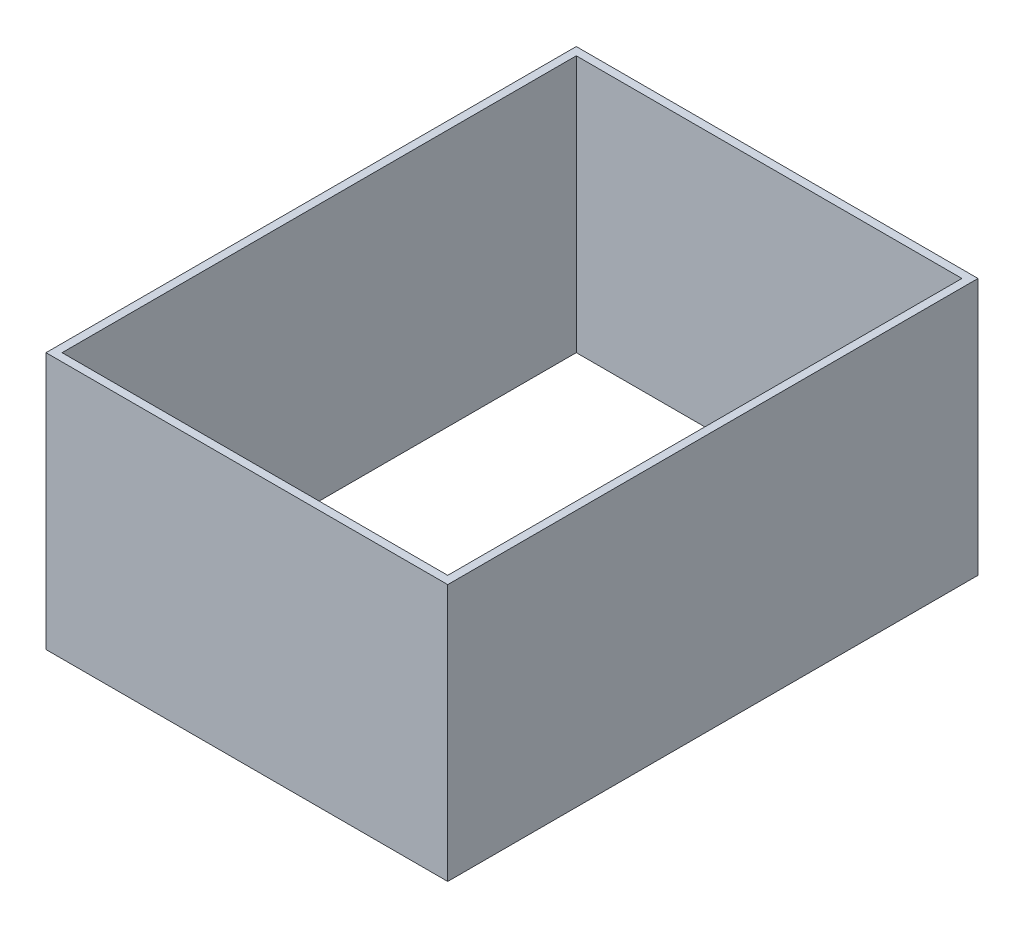
ISO-10303-21;
HEADER;
FILE_DESCRIPTION(('STEP AP214'),'2;1');
FILE_NAME('part.step','',(''),(''),'','','');
FILE_SCHEMA(('AUTOMOTIVE_DESIGN { 1 0 10303 214 1 1 1 1 }'));
ENDSEC;
DATA;
#1=APPLICATION_CONTEXT('core data for automotive mechanical design processes');
#2=APPLICATION_PROTOCOL_DEFINITION('international standard','automotive_design',2000,#1);
#3=PRODUCT_CONTEXT('',#1,'mechanical');
#4=PRODUCT('Part','Part','',(#3));
#5=PRODUCT_RELATED_PRODUCT_CATEGORY('part','',(#4));
#6=PRODUCT_DEFINITION_FORMATION('','',#4);
#7=PRODUCT_DEFINITION_CONTEXT('part definition',#1,'design');
#8=PRODUCT_DEFINITION('design','',#6,#7);
#9=PRODUCT_DEFINITION_SHAPE('','',#8);
#10=(LENGTH_UNIT() NAMED_UNIT(*) SI_UNIT(.MILLI.,.METRE.));
#11=(NAMED_UNIT(*) PLANE_ANGLE_UNIT() SI_UNIT($,.RADIAN.));
#12=(NAMED_UNIT(*) SI_UNIT($,.STERADIAN.) SOLID_ANGLE_UNIT());
#13=UNCERTAINTY_MEASURE_WITH_UNIT(LENGTH_MEASURE(1.E-05),#10,'distance_accuracy_value','');
#14=(GEOMETRIC_REPRESENTATION_CONTEXT(3) GLOBAL_UNCERTAINTY_ASSIGNED_CONTEXT((#13)) GLOBAL_UNIT_ASSIGNED_CONTEXT((#10,
#11,#12)) REPRESENTATION_CONTEXT('',''));
#15=CARTESIAN_POINT('',(0.,0.,0.));
#16=DIRECTION('',(0.,0.,1.));
#17=DIRECTION('',(1.,0.,0.));
#18=AXIS2_PLACEMENT_3D('',#15,#16,#17);
#19=CARTESIAN_POINT('',(0.,101.6,0.));
#20=DIRECTION('',(0.,-1.,0.));
#21=DIRECTION('',(0.,0.,-1.));
#22=AXIS2_PLACEMENT_3D('',#19,#20,#21);
#23=PLANE('',#22);
#24=DIRECTION('',(0.,0.,-1.));
#25=VECTOR('',#24,1.);
#26=CARTESIAN_POINT('',(79.375,101.6,0.));
#27=LINE('',#26,#25);
#28=CARTESIAN_POINT('',(79.375,101.6,104.775));
#29=VERTEX_POINT('',#28);
#30=CARTESIAN_POINT('',(79.375,101.6,-104.775));
#31=VERTEX_POINT('',#30);
#32=EDGE_CURVE('E181',#29,#31,#27,.T.);
#33=ORIENTED_EDGE('',*,*,#32,.T.);
#34=DIRECTION('',(-1.,0.,0.));
#35=VECTOR('',#34,1.);
#36=CARTESIAN_POINT('',(0.,101.6,-104.775));
#37=LINE('',#36,#35);
#38=CARTESIAN_POINT('',(-79.375,101.6,-104.775));
#39=VERTEX_POINT('',#38);
#40=EDGE_CURVE('E190',#31,#39,#37,.T.);
#41=ORIENTED_EDGE('',*,*,#40,.T.);
#42=DIRECTION('',(0.,0.,1.));
#43=VECTOR('',#42,1.);
#44=CARTESIAN_POINT('',(-79.375,101.6,0.));
#45=LINE('',#44,#43);
#46=CARTESIAN_POINT('',(-79.375,101.6,104.775));
#47=VERTEX_POINT('',#46);
#48=EDGE_CURVE('E192',#39,#47,#45,.T.);
#49=ORIENTED_EDGE('',*,*,#48,.T.);
#50=DIRECTION('',(1.,0.,0.));
#51=VECTOR('',#50,1.);
#52=CARTESIAN_POINT('',(0.,101.6,104.775));
#53=LINE('',#52,#51);
#54=EDGE_CURVE('E49',#47,#29,#53,.T.);
#55=ORIENTED_EDGE('',*,*,#54,.T.);
#56=EDGE_LOOP('',(#33,#41,#49,#55));
#57=FACE_BOUND('',#56,.T.);
#58=DIRECTION('',(0.,0.,-1.));
#59=VECTOR('',#58,1.);
#60=CARTESIAN_POINT('',(76.2,101.6,101.6));
#61=LINE('',#60,#59);
#62=CARTESIAN_POINT('',(76.2,101.6,101.6));
#63=VERTEX_POINT('',#62);
#64=CARTESIAN_POINT('',(76.2,101.6,-101.6));
#65=VERTEX_POINT('',#64);
#66=EDGE_CURVE('E115',#63,#65,#61,.T.);
#67=ORIENTED_EDGE('',*,*,#66,.F.);
#68=DIRECTION('',(1.,0.,0.));
#69=VECTOR('',#68,1.);
#70=CARTESIAN_POINT('',(-76.2,101.6,101.6));
#71=LINE('',#70,#69);
#72=CARTESIAN_POINT('',(-76.2,101.6,101.6));
#73=VERTEX_POINT('',#72);
#74=EDGE_CURVE('E142',#73,#63,#71,.T.);
#75=ORIENTED_EDGE('',*,*,#74,.F.);
#76=DIRECTION('',(0.,0.,1.));
#77=VECTOR('',#76,1.);
#78=CARTESIAN_POINT('',(-76.2,101.6,101.6));
#79=LINE('',#78,#77);
#80=CARTESIAN_POINT('',(-76.2,101.6,-101.6));
#81=VERTEX_POINT('',#80);
#82=EDGE_CURVE('E138',#81,#73,#79,.T.);
#83=ORIENTED_EDGE('',*,*,#82,.F.);
#84=DIRECTION('',(-1.,0.,0.));
#85=VECTOR('',#84,1.);
#86=CARTESIAN_POINT('',(-76.2,101.6,-101.6));
#87=LINE('',#86,#85);
#88=EDGE_CURVE('E126',#65,#81,#87,.T.);
#89=ORIENTED_EDGE('',*,*,#88,.F.);
#90=EDGE_LOOP('',(#67,#75,#83,#89));
#91=FACE_BOUND('',#90,.T.);
#92=ADVANCED_FACE('F45',(#57,#91),#23,.F.);
#93=CARTESIAN_POINT('',(0.,0.,0.));
#94=DIRECTION('',(0.,-1.,0.));
#95=DIRECTION('',(0.,0.,-1.));
#96=AXIS2_PLACEMENT_3D('',#93,#94,#95);
#97=PLANE('',#96);
#98=DIRECTION('',(0.,0.,-1.));
#99=VECTOR('',#98,1.);
#100=CARTESIAN_POINT('',(79.375,0.,0.));
#101=LINE('',#100,#99);
#102=CARTESIAN_POINT('',(79.375,0.,104.775));
#103=VERTEX_POINT('',#102);
#104=CARTESIAN_POINT('',(79.375,0.,-104.775));
#105=VERTEX_POINT('',#104);
#106=EDGE_CURVE('E134',#103,#105,#101,.T.);
#107=ORIENTED_EDGE('',*,*,#106,.F.);
#108=DIRECTION('',(1.,0.,0.));
#109=VECTOR('',#108,1.);
#110=CARTESIAN_POINT('',(0.,0.,104.775));
#111=LINE('',#110,#109);
#112=CARTESIAN_POINT('',(-79.375,0.,104.775));
#113=VERTEX_POINT('',#112);
#114=EDGE_CURVE('E178',#113,#103,#111,.T.);
#115=ORIENTED_EDGE('',*,*,#114,.F.);
#116=DIRECTION('',(0.,0.,1.));
#117=VECTOR('',#116,1.);
#118=CARTESIAN_POINT('',(-79.375,0.,0.));
#119=LINE('',#118,#117);
#120=CARTESIAN_POINT('',(-79.375,0.,-104.775));
#121=VERTEX_POINT('',#120);
#122=EDGE_CURVE('E182',#121,#113,#119,.T.);
#123=ORIENTED_EDGE('',*,*,#122,.F.);
#124=DIRECTION('',(-1.,0.,0.));
#125=VECTOR('',#124,1.);
#126=CARTESIAN_POINT('',(0.,0.,-104.775));
#127=LINE('',#126,#125);
#128=EDGE_CURVE('E177',#105,#121,#127,.T.);
#129=ORIENTED_EDGE('',*,*,#128,.F.);
#130=EDGE_LOOP('',(#107,#115,#123,#129));
#131=FACE_BOUND('',#130,.T.);
#132=DIRECTION('',(1.,0.,0.));
#133=VECTOR('',#132,1.);
#134=CARTESIAN_POINT('',(-76.2,0.,101.6));
#135=LINE('',#134,#133);
#136=CARTESIAN_POINT('',(-76.2,0.,101.6));
#137=VERTEX_POINT('',#136);
#138=CARTESIAN_POINT('',(76.2,0.,101.6));
#139=VERTEX_POINT('',#138);
#140=EDGE_CURVE('E127',#137,#139,#135,.T.);
#141=ORIENTED_EDGE('',*,*,#140,.T.);
#142=DIRECTION('',(0.,0.,-1.));
#143=VECTOR('',#142,1.);
#144=CARTESIAN_POINT('',(76.2,0.,101.6));
#145=LINE('',#144,#143);
#146=CARTESIAN_POINT('',(76.2,0.,-101.6));
#147=VERTEX_POINT('',#146);
#148=EDGE_CURVE('E147',#139,#147,#145,.T.);
#149=ORIENTED_EDGE('',*,*,#148,.T.);
#150=DIRECTION('',(-1.,0.,0.));
#151=VECTOR('',#150,1.);
#152=CARTESIAN_POINT('',(-76.2,0.,-101.6));
#153=LINE('',#152,#151);
#154=CARTESIAN_POINT('',(-76.2,0.,-101.6));
#155=VERTEX_POINT('',#154);
#156=EDGE_CURVE('E132',#147,#155,#153,.T.);
#157=ORIENTED_EDGE('',*,*,#156,.T.);
#158=DIRECTION('',(0.,0.,1.));
#159=VECTOR('',#158,1.);
#160=CARTESIAN_POINT('',(-76.2,0.,101.6));
#161=LINE('',#160,#159);
#162=EDGE_CURVE('E70',#155,#137,#161,.T.);
#163=ORIENTED_EDGE('',*,*,#162,.T.);
#164=EDGE_LOOP('',(#141,#149,#157,#163));
#165=FACE_BOUND('',#164,.T.);
#166=ADVANCED_FACE('F214',(#131,#165),#97,.T.);
#167=CARTESIAN_POINT('',(79.375,101.6,101.6));
#168=DIRECTION('',(-1.,0.,0.));
#169=DIRECTION('',(0.,0.,1.));
#170=AXIS2_PLACEMENT_3D('',#167,#168,#169);
#171=PLANE('',#170);
#172=ORIENTED_EDGE('',*,*,#106,.T.);
#173=DIRECTION('',(0.,-1.,0.));
#174=VECTOR('',#173,1.);
#175=CARTESIAN_POINT('',(79.375,101.6,-104.775));
#176=LINE('',#175,#174);
#177=EDGE_CURVE('E11',#31,#105,#176,.T.);
#178=ORIENTED_EDGE('',*,*,#177,.F.);
#179=ORIENTED_EDGE('',*,*,#32,.F.);
#180=DIRECTION('',(0.,-1.,0.));
#181=VECTOR('',#180,1.);
#182=CARTESIAN_POINT('',(79.375,101.6,104.775));
#183=LINE('',#182,#181);
#184=EDGE_CURVE('E163',#29,#103,#183,.T.);
#185=ORIENTED_EDGE('',*,*,#184,.T.);
#186=EDGE_LOOP('',(#172,#178,#179,#185));
#187=FACE_BOUND('',#186,.T.);
#188=ADVANCED_FACE('F206',(#187),#171,.F.);
#189=CARTESIAN_POINT('',(-76.2,101.6,-104.775));
#190=DIRECTION('',(0.,0.,1.));
#191=DIRECTION('',(1.,0.,0.));
#192=AXIS2_PLACEMENT_3D('',#189,#190,#191);
#193=PLANE('',#192);
#194=ORIENTED_EDGE('',*,*,#128,.T.);
#195=DIRECTION('',(0.,-1.,0.));
#196=VECTOR('',#195,1.);
#197=CARTESIAN_POINT('',(-79.375,101.6,-104.775));
#198=LINE('',#197,#196);
#199=EDGE_CURVE('E55',#39,#121,#198,.T.);
#200=ORIENTED_EDGE('',*,*,#199,.F.);
#201=ORIENTED_EDGE('',*,*,#40,.F.);
#202=ORIENTED_EDGE('',*,*,#177,.T.);
#203=EDGE_LOOP('',(#194,#200,#201,#202));
#204=FACE_BOUND('',#203,.T.);
#205=ADVANCED_FACE('F208',(#204),#193,.F.);
#206=CARTESIAN_POINT('',(-79.375,101.6,101.6));
#207=DIRECTION('',(1.,0.,0.));
#208=DIRECTION('',(0.,0.,-1.));
#209=AXIS2_PLACEMENT_3D('',#206,#207,#208);
#210=PLANE('',#209);
#211=ORIENTED_EDGE('',*,*,#122,.T.);
#212=DIRECTION('',(0.,-1.,0.));
#213=VECTOR('',#212,1.);
#214=CARTESIAN_POINT('',(-79.375,101.6,104.775));
#215=LINE('',#214,#213);
#216=EDGE_CURVE('E167',#47,#113,#215,.T.);
#217=ORIENTED_EDGE('',*,*,#216,.F.);
#218=ORIENTED_EDGE('',*,*,#48,.F.);
#219=ORIENTED_EDGE('',*,*,#199,.T.);
#220=EDGE_LOOP('',(#211,#217,#218,#219));
#221=FACE_BOUND('',#220,.T.);
#222=ADVANCED_FACE('F212',(#221),#210,.F.);
#223=CARTESIAN_POINT('',(-76.2,101.6,104.775));
#224=DIRECTION('',(0.,0.,-1.));
#225=DIRECTION('',(-1.,0.,0.));
#226=AXIS2_PLACEMENT_3D('',#223,#224,#225);
#227=PLANE('',#226);
#228=ORIENTED_EDGE('',*,*,#114,.T.);
#229=ORIENTED_EDGE('',*,*,#184,.F.);
#230=ORIENTED_EDGE('',*,*,#54,.F.);
#231=ORIENTED_EDGE('',*,*,#216,.T.);
#232=EDGE_LOOP('',(#228,#229,#230,#231));
#233=FACE_BOUND('',#232,.T.);
#234=ADVANCED_FACE('F47',(#233),#227,.F.);
#235=CARTESIAN_POINT('',(76.2,101.6,101.6));
#236=DIRECTION('',(-1.,0.,0.));
#237=DIRECTION('',(0.,0.,1.));
#238=AXIS2_PLACEMENT_3D('',#235,#236,#237);
#239=PLANE('',#238);
#240=ORIENTED_EDGE('',*,*,#148,.F.);
#241=DIRECTION('',(0.,-1.,0.));
#242=VECTOR('',#241,1.);
#243=CARTESIAN_POINT('',(76.2,101.6,101.6));
#244=LINE('',#243,#242);
#245=EDGE_CURVE('E121',#63,#139,#244,.T.);
#246=ORIENTED_EDGE('',*,*,#245,.F.);
#247=ORIENTED_EDGE('',*,*,#66,.T.);
#248=DIRECTION('',(0.,-1.,0.));
#249=VECTOR('',#248,1.);
#250=CARTESIAN_POINT('',(76.2,101.6,-101.6));
#251=LINE('',#250,#249);
#252=EDGE_CURVE('E119',#65,#147,#251,.T.);
#253=ORIENTED_EDGE('',*,*,#252,.T.);
#254=EDGE_LOOP('',(#240,#246,#247,#253));
#255=FACE_BOUND('',#254,.T.);
#256=ADVANCED_FACE('F118',(#255),#239,.T.);
#257=CARTESIAN_POINT('',(-76.2,101.6,-101.6));
#258=DIRECTION('',(0.,0.,1.));
#259=DIRECTION('',(1.,0.,0.));
#260=AXIS2_PLACEMENT_3D('',#257,#258,#259);
#261=PLANE('',#260);
#262=ORIENTED_EDGE('',*,*,#156,.F.);
#263=ORIENTED_EDGE('',*,*,#252,.F.);
#264=ORIENTED_EDGE('',*,*,#88,.T.);
#265=DIRECTION('',(0.,-1.,0.));
#266=VECTOR('',#265,1.);
#267=CARTESIAN_POINT('',(-76.2,101.6,-101.6));
#268=LINE('',#267,#266);
#269=EDGE_CURVE('E135',#81,#155,#268,.T.);
#270=ORIENTED_EDGE('',*,*,#269,.T.);
#271=EDGE_LOOP('',(#262,#263,#264,#270));
#272=FACE_BOUND('',#271,.T.);
#273=ADVANCED_FACE('F130',(#272),#261,.T.);
#274=CARTESIAN_POINT('',(-76.2,101.6,101.6));
#275=DIRECTION('',(1.,0.,0.));
#276=DIRECTION('',(0.,0.,-1.));
#277=AXIS2_PLACEMENT_3D('',#274,#275,#276);
#278=PLANE('',#277);
#279=ORIENTED_EDGE('',*,*,#162,.F.);
#280=ORIENTED_EDGE('',*,*,#269,.F.);
#281=ORIENTED_EDGE('',*,*,#82,.T.);
#282=DIRECTION('',(0.,-1.,0.));
#283=VECTOR('',#282,1.);
#284=CARTESIAN_POINT('',(-76.2,101.6,101.6));
#285=LINE('',#284,#283);
#286=EDGE_CURVE('E63',#73,#137,#285,.T.);
#287=ORIENTED_EDGE('',*,*,#286,.T.);
#288=EDGE_LOOP('',(#279,#280,#281,#287));
#289=FACE_BOUND('',#288,.T.);
#290=ADVANCED_FACE('F220',(#289),#278,.T.);
#291=CARTESIAN_POINT('',(-76.2,101.6,101.6));
#292=DIRECTION('',(0.,0.,-1.));
#293=DIRECTION('',(-1.,0.,0.));
#294=AXIS2_PLACEMENT_3D('',#291,#292,#293);
#295=PLANE('',#294);
#296=ORIENTED_EDGE('',*,*,#140,.F.);
#297=ORIENTED_EDGE('',*,*,#286,.F.);
#298=ORIENTED_EDGE('',*,*,#74,.T.);
#299=ORIENTED_EDGE('',*,*,#245,.T.);
#300=EDGE_LOOP('',(#296,#297,#298,#299));
#301=FACE_BOUND('',#300,.T.);
#302=ADVANCED_FACE('F218',(#301),#295,.T.);
#303=CLOSED_SHELL('',(#92,#166,#188,#205,#222,#234,#256,#273,#290,#302));
#304=MANIFOLD_SOLID_BREP('B2',#303);
#305=ADVANCED_BREP_SHAPE_REPRESENTATION('',(#18,#304),#14);
#306=SHAPE_DEFINITION_REPRESENTATION(#9,#305);
ENDSEC;
END-ISO-10303-21;
